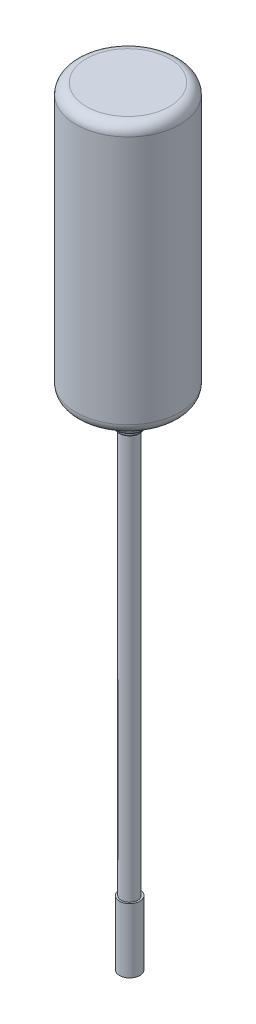
ISO-10303-21;
HEADER;
FILE_DESCRIPTION(('STEP AP214'),'2;1');
FILE_NAME('part.step','',(''),(''),'','','');
FILE_SCHEMA(('AUTOMOTIVE_DESIGN { 1 0 10303 214 1 1 1 1 }'));
ENDSEC;
DATA;
#1=APPLICATION_CONTEXT('core data for automotive mechanical design processes');
#2=APPLICATION_PROTOCOL_DEFINITION('international standard','automotive_design',2000,#1);
#3=PRODUCT_CONTEXT('',#1,'mechanical');
#4=PRODUCT('Part','Part','',(#3));
#5=PRODUCT_RELATED_PRODUCT_CATEGORY('part','',(#4));
#6=PRODUCT_DEFINITION_FORMATION('','',#4);
#7=PRODUCT_DEFINITION_CONTEXT('part definition',#1,'design');
#8=PRODUCT_DEFINITION('design','',#6,#7);
#9=PRODUCT_DEFINITION_SHAPE('','',#8);
#10=(LENGTH_UNIT() NAMED_UNIT(*) SI_UNIT(.MILLI.,.METRE.));
#11=(NAMED_UNIT(*) PLANE_ANGLE_UNIT() SI_UNIT($,.RADIAN.));
#12=(NAMED_UNIT(*) SI_UNIT($,.STERADIAN.) SOLID_ANGLE_UNIT());
#13=UNCERTAINTY_MEASURE_WITH_UNIT(LENGTH_MEASURE(1.E-05),#10,'distance_accuracy_value','');
#14=(GEOMETRIC_REPRESENTATION_CONTEXT(3) GLOBAL_UNCERTAINTY_ASSIGNED_CONTEXT((#13)) GLOBAL_UNIT_ASSIGNED_CONTEXT((#10,
#11,#12)) REPRESENTATION_CONTEXT('',''));
#15=CARTESIAN_POINT('',(0.,0.,0.));
#16=DIRECTION('',(0.,0.,1.));
#17=DIRECTION('',(1.,0.,0.));
#18=AXIS2_PLACEMENT_3D('',#15,#16,#17);
#19=CARTESIAN_POINT('',(-177.963076725531,-130.,16.9064922889254));
#20=DIRECTION('',(0.,1.,0.));
#21=DIRECTION('',(0.,0.,1.));
#22=AXIS2_PLACEMENT_3D('',#19,#20,#21);
#23=CYLINDRICAL_SURFACE('',#22,25.);
#24=CARTESIAN_POINT('',(-177.963076725531,-5.,16.9064922889254));
#25=DIRECTION('',(0.,1.,0.));
#26=DIRECTION('',(0.,0.,1.));
#27=AXIS2_PLACEMENT_3D('',#24,#25,#26);
#28=CIRCLE('',#27,25.);
#29=CARTESIAN_POINT('',(-177.963076725531,-5.,41.9064922889254));
#30=VERTEX_POINT('',#29);
#31=EDGE_CURVE('E97',#30,#30,#28,.F.);
#32=ORIENTED_EDGE('',*,*,#31,.T.);
#33=EDGE_LOOP('',(#32));
#34=FACE_BOUND('',#33,.T.);
#35=CARTESIAN_POINT('',(-177.963076725531,-125.,16.9064922889254));
#36=DIRECTION('',(0.,1.,0.));
#37=DIRECTION('',(0.,0.,1.));
#38=AXIS2_PLACEMENT_3D('',#35,#36,#37);
#39=CIRCLE('',#38,25.);
#40=CARTESIAN_POINT('',(-177.963076725531,-125.,41.9064922889254));
#41=VERTEX_POINT('',#40);
#42=EDGE_CURVE('E101',#41,#41,#39,.T.);
#43=ORIENTED_EDGE('',*,*,#42,.T.);
#44=EDGE_LOOP('',(#43));
#45=FACE_BOUND('',#44,.T.);
#46=ADVANCED_FACE('F39',(#34,#45),#23,.T.);
#47=CARTESIAN_POINT('',(-177.963076725531,-130.,16.9064922889254));
#48=DIRECTION('',(0.,1.,0.));
#49=DIRECTION('',(0.,0.,1.));
#50=AXIS2_PLACEMENT_3D('',#47,#48,#49);
#51=PLANE('',#50);
#52=CARTESIAN_POINT('',(-177.682359616952,-130.,16.368630896313));
#53=DIRECTION('',(0.,1.,0.));
#54=DIRECTION('',(0.,0.,1.));
#55=AXIS2_PLACEMENT_3D('',#52,#53,#54);
#56=CIRCLE('',#55,8.00000000000001);
#57=CARTESIAN_POINT('',(-177.682359616952,-130.,24.368630896313));
#58=VERTEX_POINT('',#57);
#59=EDGE_CURVE('E79',#58,#58,#56,.F.);
#60=ORIENTED_EDGE('',*,*,#59,.F.);
#61=EDGE_LOOP('',(#60));
#62=FACE_BOUND('',#61,.T.);
#63=CARTESIAN_POINT('',(-177.963076725531,-130.,16.9064922889254));
#64=DIRECTION('',(0.,1.,0.));
#65=DIRECTION('',(0.,0.,1.));
#66=AXIS2_PLACEMENT_3D('',#63,#64,#65);
#67=CIRCLE('',#66,20.);
#68=CARTESIAN_POINT('',(-177.963076725531,-130.,36.9064922889254));
#69=VERTEX_POINT('',#68);
#70=EDGE_CURVE('E93',#69,#69,#67,.F.);
#71=ORIENTED_EDGE('',*,*,#70,.T.);
#72=EDGE_LOOP('',(#71));
#73=FACE_BOUND('',#72,.T.);
#74=ADVANCED_FACE('F147',(#62,#73),#51,.F.);
#75=CARTESIAN_POINT('',(-177.963076725531,0.,16.9064922889254));
#76=DIRECTION('',(0.,1.,0.));
#77=DIRECTION('',(0.,0.,1.));
#78=AXIS2_PLACEMENT_3D('',#75,#76,#77);
#79=PLANE('',#78);
#80=CARTESIAN_POINT('',(-177.963076725531,0.,16.9064922889254));
#81=DIRECTION('',(0.,1.,0.));
#82=DIRECTION('',(0.,0.,1.));
#83=AXIS2_PLACEMENT_3D('',#80,#81,#82);
#84=CIRCLE('',#83,20.);
#85=CARTESIAN_POINT('',(-177.963076725531,0.,36.9064922889254));
#86=VERTEX_POINT('',#85);
#87=EDGE_CURVE('E105',#86,#86,#84,.T.);
#88=ORIENTED_EDGE('',*,*,#87,.T.);
#89=EDGE_LOOP('',(#88));
#90=FACE_BOUND('',#89,.T.);
#91=ADVANCED_FACE('F153',(#90),#79,.T.);
#92=CARTESIAN_POINT('',(-177.963076725531,-5.,16.9064922889254));
#93=DIRECTION('',(0.,1.,0.));
#94=DIRECTION('',(0.,0.,1.));
#95=AXIS2_PLACEMENT_3D('',#92,#93,#94);
#96=TOROIDAL_SURFACE('',#95,20.,5.);
#97=ORIENTED_EDGE('',*,*,#31,.F.);
#98=EDGE_LOOP('',(#97));
#99=FACE_BOUND('',#98,.T.);
#100=ORIENTED_EDGE('',*,*,#87,.F.);
#101=EDGE_LOOP('',(#100));
#102=FACE_BOUND('',#101,.T.);
#103=ADVANCED_FACE('F159',(#99,#102),#96,.T.);
#104=CARTESIAN_POINT('',(-177.963076725531,-125.,16.9064922889254));
#105=DIRECTION('',(0.,1.,0.));
#106=DIRECTION('',(0.,0.,1.));
#107=AXIS2_PLACEMENT_3D('',#104,#105,#106);
#108=TOROIDAL_SURFACE('',#107,20.,5.);
#109=ORIENTED_EDGE('',*,*,#70,.F.);
#110=EDGE_LOOP('',(#109));
#111=FACE_BOUND('',#110,.T.);
#112=ORIENTED_EDGE('',*,*,#42,.F.);
#113=EDGE_LOOP('',(#112));
#114=FACE_BOUND('',#113,.T.);
#115=ADVANCED_FACE('F162',(#111,#114),#108,.T.);
#116=CARTESIAN_POINT('',(-177.682359616952,-136.,16.368630896313));
#117=DIRECTION('',(0.,1.,0.));
#118=DIRECTION('',(0.,0.,1.));
#119=AXIS2_PLACEMENT_3D('',#116,#117,#118);
#120=CYLINDRICAL_SURFACE('',#119,8.00000000000001);
#121=CARTESIAN_POINT('',(-177.682359616952,-135.,16.368630896313));
#122=DIRECTION('',(0.,-1.,0.));
#123=DIRECTION('',(0.,0.,-1.));
#124=AXIS2_PLACEMENT_3D('',#121,#122,#123);
#125=CIRCLE('',#124,8.00000000000001);
#126=CARTESIAN_POINT('',(-177.682359616952,-135.,8.36863089631296));
#127=VERTEX_POINT('',#126);
#128=EDGE_CURVE('E63',#127,#127,#125,.F.);
#129=ORIENTED_EDGE('',*,*,#128,.T.);
#130=EDGE_LOOP('',(#129));
#131=FACE_BOUND('',#130,.T.);
#132=ORIENTED_EDGE('',*,*,#59,.T.);
#133=EDGE_LOOP('',(#132));
#134=FACE_BOUND('',#133,.T.);
#135=ADVANCED_FACE('F166',(#131,#134),#120,.T.);
#136=CARTESIAN_POINT('',(-177.682359616952,-136.,16.368630896313));
#137=DIRECTION('',(0.,-1.,0.));
#138=DIRECTION('',(0.,0.,-1.));
#139=AXIS2_PLACEMENT_3D('',#136,#137,#138);
#140=PLANE('',#139);
#141=CARTESIAN_POINT('',(-177.682359616952,-136.,16.368630896313));
#142=DIRECTION('',(0.,-1.,0.));
#143=DIRECTION('',(0.,0.,-1.));
#144=AXIS2_PLACEMENT_3D('',#141,#142,#143);
#145=CIRCLE('',#144,7.00000000000001);
#146=CARTESIAN_POINT('',(-177.682359616952,-136.,9.36863089631296));
#147=VERTEX_POINT('',#146);
#148=EDGE_CURVE('E67',#147,#147,#145,.T.);
#149=ORIENTED_EDGE('',*,*,#148,.T.);
#150=EDGE_LOOP('',(#149));
#151=FACE_BOUND('',#150,.T.);
#152=CARTESIAN_POINT('',(-177.67388068842,-136.,16.4598075129217));
#153=DIRECTION('',(0.,-1.,0.));
#154=DIRECTION('',(0.,0.,-1.));
#155=AXIS2_PLACEMENT_3D('',#152,#153,#154);
#156=CIRCLE('',#155,6.00812190523188);
#157=CARTESIAN_POINT('',(-177.67388068842,-136.,10.4516856076898));
#158=VERTEX_POINT('',#157);
#159=EDGE_CURVE('E114',#158,#158,#156,.T.);
#160=ORIENTED_EDGE('',*,*,#159,.F.);
#161=EDGE_LOOP('',(#160));
#162=FACE_BOUND('',#161,.T.);
#163=ADVANCED_FACE('F192',(#151,#162),#140,.T.);
#164=CARTESIAN_POINT('',(-177.67388068842,-139.,16.4598075129217));
#165=DIRECTION('',(0.,1.,0.));
#166=DIRECTION('',(0.,0.,1.));
#167=AXIS2_PLACEMENT_3D('',#164,#165,#166);
#168=CYLINDRICAL_SURFACE('',#167,6.00812190523188);
#169=CARTESIAN_POINT('',(-177.67388068842,-138.3,16.4598075129217));
#170=DIRECTION('',(0.,-1.,0.));
#171=DIRECTION('',(0.,0.,-1.));
#172=AXIS2_PLACEMENT_3D('',#169,#170,#171);
#173=CIRCLE('',#172,6.00812190523188);
#174=CARTESIAN_POINT('',(-177.67388068842,-138.3,10.4516856076898));
#175=VERTEX_POINT('',#174);
#176=EDGE_CURVE('E52',#175,#175,#173,.F.);
#177=ORIENTED_EDGE('',*,*,#176,.T.);
#178=EDGE_LOOP('',(#177));
#179=FACE_BOUND('',#178,.T.);
#180=ORIENTED_EDGE('',*,*,#159,.T.);
#181=EDGE_LOOP('',(#180));
#182=FACE_BOUND('',#181,.T.);
#183=ADVANCED_FACE('F142',(#179,#182),#168,.T.);
#184=CARTESIAN_POINT('',(-177.682359616952,-142.,16.368630896313));
#185=DIRECTION('',(0.,1.,0.));
#186=DIRECTION('',(0.,0.,1.));
#187=AXIS2_PLACEMENT_3D('',#184,#185,#186);
#188=CYLINDRICAL_SURFACE('',#187,7.00000000000001);
#189=CARTESIAN_POINT('',(-177.682359616952,-141.,16.368630896313));
#190=DIRECTION('',(0.,-1.,0.));
#191=DIRECTION('',(0.,0.,-1.));
#192=AXIS2_PLACEMENT_3D('',#189,#190,#191);
#193=CIRCLE('',#192,7.00000000000001);
#194=CARTESIAN_POINT('',(-177.682359616952,-141.,9.36863089631296));
#195=VERTEX_POINT('',#194);
#196=EDGE_CURVE('E71',#195,#195,#193,.F.);
#197=ORIENTED_EDGE('',*,*,#196,.T.);
#198=EDGE_LOOP('',(#197));
#199=FACE_BOUND('',#198,.T.);
#200=CARTESIAN_POINT('',(-177.682359616952,-139.,16.368630896313));
#201=DIRECTION('',(0.,-1.,0.));
#202=DIRECTION('',(0.,0.,-1.));
#203=AXIS2_PLACEMENT_3D('',#200,#201,#202);
#204=CIRCLE('',#203,7.00000000000001);
#205=CARTESIAN_POINT('',(-177.682359616952,-139.,9.36863089631296));
#206=VERTEX_POINT('',#205);
#207=EDGE_CURVE('E84',#206,#206,#204,.T.);
#208=ORIENTED_EDGE('',*,*,#207,.T.);
#209=EDGE_LOOP('',(#208));
#210=FACE_BOUND('',#209,.T.);
#211=ADVANCED_FACE('F133',(#199,#210),#188,.T.);
#212=CARTESIAN_POINT('',(-177.682359616952,-142.,16.368630896313));
#213=DIRECTION('',(0.,-1.,0.));
#214=DIRECTION('',(0.,0.,-1.));
#215=AXIS2_PLACEMENT_3D('',#212,#213,#214);
#216=PLANE('',#215);
#217=CARTESIAN_POINT('',(-177.682359616952,-142.,16.368630896313));
#218=DIRECTION('',(0.,-1.,0.));
#219=DIRECTION('',(0.,0.,-1.));
#220=AXIS2_PLACEMENT_3D('',#217,#218,#219);
#221=CIRCLE('',#220,6.00000000000001);
#222=CARTESIAN_POINT('',(-177.682359616952,-142.,10.368630896313));
#223=VERTEX_POINT('',#222);
#224=EDGE_CURVE('E75',#223,#223,#221,.T.);
#225=ORIENTED_EDGE('',*,*,#224,.T.);
#226=EDGE_LOOP('',(#225));
#227=FACE_BOUND('',#226,.T.);
#228=CARTESIAN_POINT('',(-177.67388068842,-142.,16.4598075129217));
#229=DIRECTION('',(0.,-1.,0.));
#230=DIRECTION('',(0.,0.,-1.));
#231=AXIS2_PLACEMENT_3D('',#228,#229,#230);
#232=CIRCLE('',#231,5.12035174227926);
#233=CARTESIAN_POINT('',(-177.67388068842,-142.,11.3394557706424));
#234=VERTEX_POINT('',#233);
#235=EDGE_CURVE('E85',#234,#234,#232,.T.);
#236=ORIENTED_EDGE('',*,*,#235,.F.);
#237=EDGE_LOOP('',(#236));
#238=FACE_BOUND('',#237,.T.);
#239=ADVANCED_FACE('F130',(#227,#238),#216,.T.);
#240=CARTESIAN_POINT('',(-177.682359616952,-139.,16.368630896313));
#241=DIRECTION('',(0.,-1.,0.));
#242=DIRECTION('',(0.,0.,-1.));
#243=AXIS2_PLACEMENT_3D('',#240,#241,#242);
#244=PLANE('',#243);
#245=CARTESIAN_POINT('',(-177.67388068842,-139.,16.4598075129217));
#246=DIRECTION('',(0.,-1.,0.));
#247=DIRECTION('',(0.,0.,-1.));
#248=AXIS2_PLACEMENT_3D('',#245,#246,#247);
#249=CIRCLE('',#248,6.70812190523188);
#250=CARTESIAN_POINT('',(-177.67388068842,-139.,9.75168560768981));
#251=VERTEX_POINT('',#250);
#252=EDGE_CURVE('E57',#251,#251,#249,.T.);
#253=ORIENTED_EDGE('',*,*,#252,.T.);
#254=EDGE_LOOP('',(#253));
#255=FACE_BOUND('',#254,.T.);
#256=ORIENTED_EDGE('',*,*,#207,.F.);
#257=EDGE_LOOP('',(#256));
#258=FACE_BOUND('',#257,.T.);
#259=ADVANCED_FACE('F132',(#255,#258),#244,.F.);
#260=CARTESIAN_POINT('',(-177.67388068842,-144.,16.4598075129217));
#261=DIRECTION('',(0.,1.,0.));
#262=DIRECTION('',(0.,0.,1.));
#263=AXIS2_PLACEMENT_3D('',#260,#261,#262);
#264=CYLINDRICAL_SURFACE('',#263,5.12035174227926);
#265=CARTESIAN_POINT('',(-177.67388068842,-143.5,16.4598075129217));
#266=DIRECTION('',(0.,-1.,0.));
#267=DIRECTION('',(0.,0.,-1.));
#268=AXIS2_PLACEMENT_3D('',#265,#266,#267);
#269=CIRCLE('',#268,5.12035174227926);
#270=CARTESIAN_POINT('',(-177.67388068842,-143.5,11.3394557706424));
#271=VERTEX_POINT('',#270);
#272=EDGE_CURVE('E10',#271,#271,#269,.F.);
#273=ORIENTED_EDGE('',*,*,#272,.T.);
#274=EDGE_LOOP('',(#273));
#275=FACE_BOUND('',#274,.T.);
#276=ORIENTED_EDGE('',*,*,#235,.T.);
#277=EDGE_LOOP('',(#276));
#278=FACE_BOUND('',#277,.T.);
#279=ADVANCED_FACE('F128',(#275,#278),#264,.T.);
#280=CARTESIAN_POINT('',(-177.67388068842,-144.,16.4598075129217));
#281=DIRECTION('',(0.,-1.,0.));
#282=DIRECTION('',(0.,0.,-1.));
#283=AXIS2_PLACEMENT_3D('',#280,#281,#282);
#284=PLANE('',#283);
#285=CARTESIAN_POINT('',(-177.67388068842,-144.,16.4598075129217));
#286=DIRECTION('',(0.,-1.,0.));
#287=DIRECTION('',(0.,0.,-1.));
#288=AXIS2_PLACEMENT_3D('',#285,#286,#287);
#289=CIRCLE('',#288,4.62035174227926);
#290=CARTESIAN_POINT('',(-177.67388068842,-144.,11.8394557706424));
#291=VERTEX_POINT('',#290);
#292=EDGE_CURVE('E47',#291,#291,#289,.T.);
#293=ORIENTED_EDGE('',*,*,#292,.T.);
#294=EDGE_LOOP('',(#293));
#295=FACE_BOUND('',#294,.T.);
#296=CARTESIAN_POINT('',(-177.67388068842,-144.,16.4598075129217));
#297=DIRECTION('',(0.,-1.,0.));
#298=DIRECTION('',(0.,0.,-1.));
#299=AXIS2_PLACEMENT_3D('',#296,#297,#298);
#300=CIRCLE('',#299,3.99999999999999);
#301=CARTESIAN_POINT('',(-177.67388068842,-144.,12.4598075129217));
#302=VERTEX_POINT('',#301);
#303=EDGE_CURVE('E80',#302,#302,#300,.T.);
#304=ORIENTED_EDGE('',*,*,#303,.F.);
#305=EDGE_LOOP('',(#304));
#306=FACE_BOUND('',#305,.T.);
#307=ADVANCED_FACE('F216',(#295,#306),#284,.T.);
#308=CARTESIAN_POINT('',(-177.67388068842,-370.,16.4598075129217));
#309=DIRECTION('',(0.,-1.,0.));
#310=DIRECTION('',(0.,0.,-1.));
#311=AXIS2_PLACEMENT_3D('',#308,#309,#310);
#312=PLANE('',#311);
#313=CARTESIAN_POINT('',(-177.682359616952,-370.,16.368630896313));
#314=DIRECTION('',(0.,-1.,0.));
#315=DIRECTION('',(0.,0.,-1.));
#316=AXIS2_PLACEMENT_3D('',#313,#314,#315);
#317=CIRCLE('',#316,4.87403152761366);
#318=CARTESIAN_POINT('',(-177.682359616952,-370.,11.4945993686993));
#319=VERTEX_POINT('',#318);
#320=EDGE_CURVE('E110',#319,#319,#317,.T.);
#321=ORIENTED_EDGE('',*,*,#320,.T.);
#322=EDGE_LOOP('',(#321));
#323=FACE_BOUND('',#322,.T.);
#324=ADVANCED_FACE('F212',(#323),#312,.T.);
#325=CARTESIAN_POINT('',(-177.682359616952,-339.,16.368630896313));
#326=DIRECTION('',(0.,-1.,0.));
#327=DIRECTION('',(0.,0.,-1.));
#328=AXIS2_PLACEMENT_3D('',#325,#326,#327);
#329=CYLINDRICAL_SURFACE('',#328,4.87403152761366);
#330=CARTESIAN_POINT('',(-177.682359616952,-339.,16.368630896313));
#331=DIRECTION('',(0.,-1.,0.));
#332=DIRECTION('',(0.,0.,-1.));
#333=AXIS2_PLACEMENT_3D('',#330,#331,#332);
#334=CIRCLE('',#333,4.87403152761366);
#335=CARTESIAN_POINT('',(-177.682359616952,-339.,11.4945993686993));
#336=VERTEX_POINT('',#335);
#337=EDGE_CURVE('E109',#336,#336,#334,.T.);
#338=ORIENTED_EDGE('',*,*,#337,.T.);
#339=EDGE_LOOP('',(#338));
#340=FACE_BOUND('',#339,.T.);
#341=ORIENTED_EDGE('',*,*,#320,.F.);
#342=EDGE_LOOP('',(#341));
#343=FACE_BOUND('',#342,.T.);
#344=ADVANCED_FACE('F208',(#340,#343),#329,.T.);
#345=CARTESIAN_POINT('',(-177.682359616952,-339.,16.368630896313));
#346=DIRECTION('',(0.,-1.,0.));
#347=DIRECTION('',(0.,0.,-1.));
#348=AXIS2_PLACEMENT_3D('',#345,#346,#347);
#349=PLANE('',#348);
#350=CARTESIAN_POINT('',(-177.67388068842,-339.,16.4598075129217));
#351=DIRECTION('',(0.,-1.,0.));
#352=DIRECTION('',(0.,0.,-1.));
#353=AXIS2_PLACEMENT_3D('',#350,#351,#352);
#354=CIRCLE('',#353,3.99999999999999);
#355=CARTESIAN_POINT('',(-177.67388068842,-339.,12.4598075129217));
#356=VERTEX_POINT('',#355);
#357=EDGE_CURVE('E89',#356,#356,#354,.T.);
#358=ORIENTED_EDGE('',*,*,#357,.T.);
#359=EDGE_LOOP('',(#358));
#360=FACE_BOUND('',#359,.T.);
#361=ORIENTED_EDGE('',*,*,#337,.F.);
#362=EDGE_LOOP('',(#361));
#363=FACE_BOUND('',#362,.T.);
#364=ADVANCED_FACE('F205',(#360,#363),#349,.F.);
#365=CARTESIAN_POINT('',(-177.67388068842,-370.,16.4598075129217));
#366=DIRECTION('',(0.,1.,0.));
#367=DIRECTION('',(0.,0.,1.));
#368=AXIS2_PLACEMENT_3D('',#365,#366,#367);
#369=CYLINDRICAL_SURFACE('',#368,3.99999999999999);
#370=ORIENTED_EDGE('',*,*,#303,.T.);
#371=EDGE_LOOP('',(#370));
#372=FACE_BOUND('',#371,.T.);
#373=ORIENTED_EDGE('',*,*,#357,.F.);
#374=EDGE_LOOP('',(#373));
#375=FACE_BOUND('',#374,.T.);
#376=ADVANCED_FACE('F172',(#372,#375),#369,.T.);
#377=CARTESIAN_POINT('',(-177.682359616952,-141.,16.368630896313));
#378=DIRECTION('',(0.,-1.,0.));
#379=DIRECTION('',(0.,0.,-1.));
#380=AXIS2_PLACEMENT_3D('',#377,#378,#379);
#381=TOROIDAL_SURFACE('',#380,6.00000000000001,1.);
#382=ORIENTED_EDGE('',*,*,#196,.F.);
#383=EDGE_LOOP('',(#382));
#384=FACE_BOUND('',#383,.T.);
#385=ORIENTED_EDGE('',*,*,#224,.F.);
#386=EDGE_LOOP('',(#385));
#387=FACE_BOUND('',#386,.T.);
#388=ADVANCED_FACE('F168',(#384,#387),#381,.T.);
#389=CARTESIAN_POINT('',(-177.682359616952,-135.,16.368630896313));
#390=DIRECTION('',(0.,-1.,0.));
#391=DIRECTION('',(0.,0.,-1.));
#392=AXIS2_PLACEMENT_3D('',#389,#390,#391);
#393=TOROIDAL_SURFACE('',#392,7.00000000000001,1.);
#394=ORIENTED_EDGE('',*,*,#128,.F.);
#395=EDGE_LOOP('',(#394));
#396=FACE_BOUND('',#395,.T.);
#397=ORIENTED_EDGE('',*,*,#148,.F.);
#398=EDGE_LOOP('',(#397));
#399=FACE_BOUND('',#398,.T.);
#400=ADVANCED_FACE('F171',(#396,#399),#393,.T.);
#401=CARTESIAN_POINT('',(-177.67388068842,-138.3,16.4598075129217));
#402=DIRECTION('',(0.,-1.,0.));
#403=DIRECTION('',(0.,0.,-1.));
#404=AXIS2_PLACEMENT_3D('',#401,#402,#403);
#405=TOROIDAL_SURFACE('',#404,6.70812190523188,0.7);
#406=ORIENTED_EDGE('',*,*,#176,.F.);
#407=EDGE_LOOP('',(#406));
#408=FACE_BOUND('',#407,.T.);
#409=ORIENTED_EDGE('',*,*,#252,.F.);
#410=EDGE_LOOP('',(#409));
#411=FACE_BOUND('',#410,.T.);
#412=ADVANCED_FACE('F175',(#408,#411),#405,.F.);
#413=CARTESIAN_POINT('',(-177.67388068842,-143.5,16.4598075129217));
#414=DIRECTION('',(0.,-1.,0.));
#415=DIRECTION('',(0.,0.,-1.));
#416=AXIS2_PLACEMENT_3D('',#413,#414,#415);
#417=TOROIDAL_SURFACE('',#416,4.62035174227926,0.5);
#418=ORIENTED_EDGE('',*,*,#272,.F.);
#419=EDGE_LOOP('',(#418));
#420=FACE_BOUND('',#419,.T.);
#421=ORIENTED_EDGE('',*,*,#292,.F.);
#422=EDGE_LOOP('',(#421));
#423=FACE_BOUND('',#422,.T.);
#424=ADVANCED_FACE('F41',(#420,#423),#417,.T.);
#425=CLOSED_SHELL('',(#46,#74,#91,#103,#115,#135,#163,#183,#211,#239,#259,#279,#307,#324,#344,
#364,#376,#388,#400,#412,#424));
#426=MANIFOLD_SOLID_BREP('B2',#425);
#427=ADVANCED_BREP_SHAPE_REPRESENTATION('',(#18,#426),#14);
#428=SHAPE_DEFINITION_REPRESENTATION(#9,#427);
ENDSEC;
END-ISO-10303-21;
